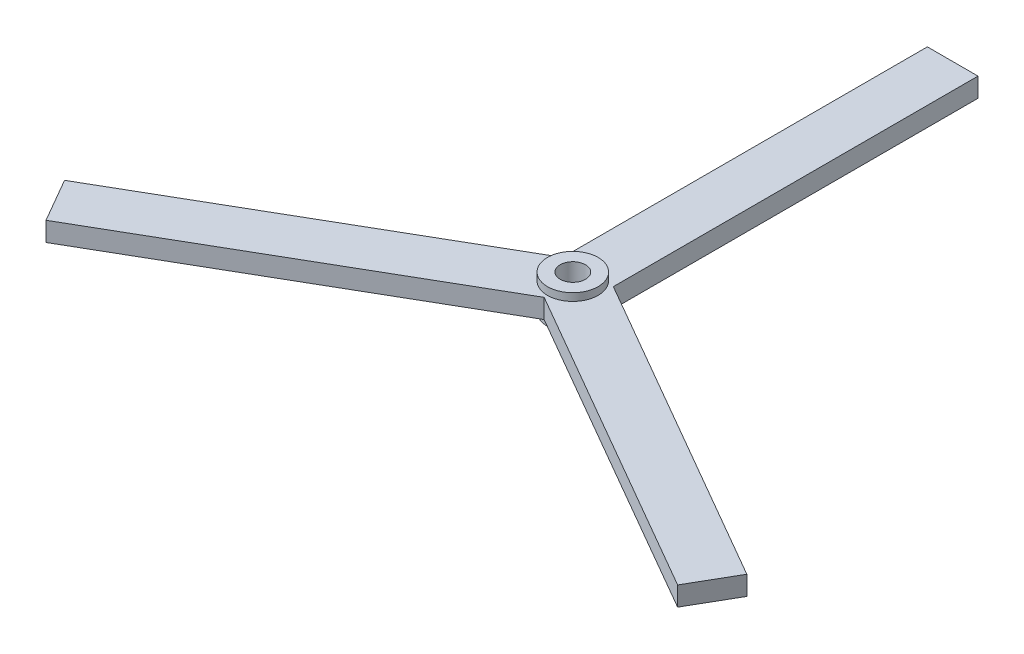
ISO-10303-21;
HEADER;
FILE_DESCRIPTION(('STEP AP214'),'2;1');
FILE_NAME('part.step','',(''),(''),'','','');
FILE_SCHEMA(('AUTOMOTIVE_DESIGN { 1 0 10303 214 1 1 1 1 }'));
ENDSEC;
DATA;
#1=APPLICATION_CONTEXT('core data for automotive mechanical design processes');
#2=APPLICATION_PROTOCOL_DEFINITION('international standard','automotive_design',2000,#1);
#3=PRODUCT_CONTEXT('',#1,'mechanical');
#4=PRODUCT('Part','Part','',(#3));
#5=PRODUCT_RELATED_PRODUCT_CATEGORY('part','',(#4));
#6=PRODUCT_DEFINITION_FORMATION('','',#4);
#7=PRODUCT_DEFINITION_CONTEXT('part definition',#1,'design');
#8=PRODUCT_DEFINITION('design','',#6,#7);
#9=PRODUCT_DEFINITION_SHAPE('','',#8);
#10=(LENGTH_UNIT() NAMED_UNIT(*) SI_UNIT(.MILLI.,.METRE.));
#11=(NAMED_UNIT(*) PLANE_ANGLE_UNIT() SI_UNIT($,.RADIAN.));
#12=(NAMED_UNIT(*) SI_UNIT($,.STERADIAN.) SOLID_ANGLE_UNIT());
#13=UNCERTAINTY_MEASURE_WITH_UNIT(LENGTH_MEASURE(1.E-05),#10,'distance_accuracy_value','');
#14=(GEOMETRIC_REPRESENTATION_CONTEXT(3) GLOBAL_UNCERTAINTY_ASSIGNED_CONTEXT((#13)) GLOBAL_UNIT_ASSIGNED_CONTEXT((#10,
#11,#12)) REPRESENTATION_CONTEXT('',''));
#15=CARTESIAN_POINT('',(0.,0.,0.));
#16=DIRECTION('',(0.,0.,1.));
#17=DIRECTION('',(1.,0.,0.));
#18=AXIS2_PLACEMENT_3D('',#15,#16,#17);
#19=CARTESIAN_POINT('',(0.,3.4,0.));
#20=DIRECTION('',(0.,-1.,0.));
#21=DIRECTION('',(0.,0.,-1.));
#22=AXIS2_PLACEMENT_3D('',#19,#20,#21);
#23=CYLINDRICAL_SURFACE('',#22,5.);
#24=CARTESIAN_POINT('',(0.,-3.4,0.));
#25=DIRECTION('',(0.,1.,0.));
#26=DIRECTION('',(0.,0.,1.));
#27=AXIS2_PLACEMENT_3D('',#24,#25,#26);
#28=CIRCLE('',#27,5.);
#29=CARTESIAN_POINT('',(0.,-3.4,5.));
#30=VERTEX_POINT('',#29);
#31=EDGE_CURVE('E187',#30,#30,#28,.T.);
#32=ORIENTED_EDGE('',*,*,#31,.T.);
#33=EDGE_LOOP('',(#32));
#34=FACE_BOUND('',#33,.T.);
#35=CARTESIAN_POINT('',(0.,-1.9,0.));
#36=DIRECTION('',(0.,1.,0.));
#37=DIRECTION('',(0.,0.,1.));
#38=AXIS2_PLACEMENT_3D('',#35,#36,#37);
#39=CIRCLE('',#38,5.);
#40=CARTESIAN_POINT('',(0.,-1.9,5.));
#41=VERTEX_POINT('',#40);
#42=EDGE_CURVE('E11',#41,#41,#39,.T.);
#43=ORIENTED_EDGE('',*,*,#42,.F.);
#44=EDGE_LOOP('',(#43));
#45=FACE_BOUND('',#44,.T.);
#46=ADVANCED_FACE('F43',(#34,#45),#23,.T.);
#47=CARTESIAN_POINT('',(0.,3.4,0.));
#48=DIRECTION('',(0.,1.,0.));
#49=DIRECTION('',(0.,0.,1.));
#50=AXIS2_PLACEMENT_3D('',#47,#48,#49);
#51=PLANE('',#50);
#52=CARTESIAN_POINT('',(0.,3.4,0.));
#53=DIRECTION('',(0.,1.,0.));
#54=DIRECTION('',(0.,0.,1.));
#55=AXIS2_PLACEMENT_3D('',#52,#53,#54);
#56=CIRCLE('',#55,5.);
#57=CARTESIAN_POINT('',(0.,3.4,5.));
#58=VERTEX_POINT('',#57);
#59=EDGE_CURVE('E52',#58,#58,#56,.T.);
#60=ORIENTED_EDGE('',*,*,#59,.T.);
#61=EDGE_LOOP('',(#60));
#62=FACE_BOUND('',#61,.T.);
#63=CARTESIAN_POINT('',(0.,3.4,0.));
#64=DIRECTION('',(0.,1.,0.));
#65=DIRECTION('',(0.,0.,1.));
#66=AXIS2_PLACEMENT_3D('',#63,#64,#65);
#67=CIRCLE('',#66,2.5);
#68=CARTESIAN_POINT('',(0.,3.4,2.5));
#69=VERTEX_POINT('',#68);
#70=EDGE_CURVE('E184',#69,#69,#67,.T.);
#71=ORIENTED_EDGE('',*,*,#70,.F.);
#72=EDGE_LOOP('',(#71));
#73=FACE_BOUND('',#72,.T.);
#74=ADVANCED_FACE('F199',(#62,#73),#51,.T.);
#75=CARTESIAN_POINT('',(0.,-3.4,0.));
#76=DIRECTION('',(0.,1.,0.));
#77=DIRECTION('',(0.,0.,1.));
#78=AXIS2_PLACEMENT_3D('',#75,#76,#77);
#79=PLANE('',#78);
#80=ORIENTED_EDGE('',*,*,#31,.F.);
#81=EDGE_LOOP('',(#80));
#82=FACE_BOUND('',#81,.T.);
#83=CARTESIAN_POINT('',(0.,-3.4,0.));
#84=DIRECTION('',(0.,1.,0.));
#85=DIRECTION('',(0.,0.,1.));
#86=AXIS2_PLACEMENT_3D('',#83,#84,#85);
#87=CIRCLE('',#86,2.5);
#88=CARTESIAN_POINT('',(0.,-3.4,2.5));
#89=VERTEX_POINT('',#88);
#90=EDGE_CURVE('E183',#89,#89,#87,.T.);
#91=ORIENTED_EDGE('',*,*,#90,.T.);
#92=EDGE_LOOP('',(#91));
#93=FACE_BOUND('',#92,.T.);
#94=ADVANCED_FACE('F196',(#82,#93),#79,.F.);
#95=CARTESIAN_POINT('',(0.,1.9,0.));
#96=DIRECTION('',(0.,1.,0.));
#97=DIRECTION('',(0.,0.,1.));
#98=AXIS2_PLACEMENT_3D('',#95,#96,#97);
#99=CIRCLE('',#98,5.);
#100=CARTESIAN_POINT('',(0.,1.9,5.));
#101=VERTEX_POINT('',#100);
#102=EDGE_CURVE('E152',#101,#101,#99,.T.);
#103=ORIENTED_EDGE('',*,*,#102,.T.);
#104=EDGE_LOOP('',(#103));
#105=FACE_BOUND('',#104,.T.);
#106=ORIENTED_EDGE('',*,*,#59,.F.);
#107=EDGE_LOOP('',(#106));
#108=FACE_BOUND('',#107,.T.);
#109=ADVANCED_FACE('F45',(#105,#108),#23,.T.);
#110=CARTESIAN_POINT('',(0.,3.4,0.));
#111=DIRECTION('',(0.,-1.,0.));
#112=DIRECTION('',(0.,0.,-1.));
#113=AXIS2_PLACEMENT_3D('',#110,#111,#112);
#114=CYLINDRICAL_SURFACE('',#113,2.5);
#115=ORIENTED_EDGE('',*,*,#70,.T.);
#116=EDGE_LOOP('',(#115));
#117=FACE_BOUND('',#116,.T.);
#118=ORIENTED_EDGE('',*,*,#90,.F.);
#119=EDGE_LOOP('',(#118));
#120=FACE_BOUND('',#119,.T.);
#121=ADVANCED_FACE('F202',(#117,#120),#114,.F.);
#122=CARTESIAN_POINT('',(0.,1.9,0.));
#123=DIRECTION('',(0.,1.,0.));
#124=DIRECTION('',(0.,0.,1.));
#125=AXIS2_PLACEMENT_3D('',#122,#123,#124);
#126=PLANE('',#125);
#127=DIRECTION('',(-1.,0.,0.));
#128=VECTOR('',#127,1.);
#129=CARTESIAN_POINT('',(-5.,1.9,-75.));
#130=LINE('',#129,#128);
#131=CARTESIAN_POINT('',(5.,1.9,-75.));
#132=VERTEX_POINT('',#131);
#133=CARTESIAN_POINT('',(-5.,1.9,-75.));
#134=VERTEX_POINT('',#133);
#135=EDGE_CURVE('E165',#132,#134,#130,.T.);
#136=ORIENTED_EDGE('',*,*,#135,.T.);
#137=DIRECTION('',(0.,0.,1.));
#138=VECTOR('',#137,1.);
#139=CARTESIAN_POINT('',(-5.,1.9,-3.00249609933335));
#140=LINE('',#139,#138);
#141=CARTESIAN_POINT('',(-5.,1.9,-3.00249609933335));
#142=VERTEX_POINT('',#141);
#143=EDGE_CURVE('E107',#134,#142,#140,.T.);
#144=ORIENTED_EDGE('',*,*,#143,.T.);
#145=DIRECTION('',(-0.866025403784439,0.,0.5));
#146=VECTOR('',#145,1.);
#147=CARTESIAN_POINT('',(-5.,1.9,-3.00249609933335));
#148=LINE('',#147,#146);
#149=CARTESIAN_POINT('',(-67.3516673870465,1.9,32.996255851));
#150=VERTEX_POINT('',#149);
#151=EDGE_CURVE('E370',#142,#150,#148,.T.);
#152=ORIENTED_EDGE('',*,*,#151,.T.);
#153=DIRECTION('',(0.5,0.,0.866025403784438));
#154=VECTOR('',#153,1.);
#155=CARTESIAN_POINT('',(-62.3516673870465,1.9,41.6565098888444));
#156=LINE('',#155,#154);
#157=CARTESIAN_POINT('',(-62.3516673870465,1.9,41.6565098888444));
#158=VERTEX_POINT('',#157);
#159=EDGE_CURVE('E375',#150,#158,#156,.T.);
#160=ORIENTED_EDGE('',*,*,#159,.T.);
#161=DIRECTION('',(0.866025403784438,0.,-0.500000000000001));
#162=VECTOR('',#161,1.);
#163=CARTESIAN_POINT('',(0.,1.9,5.65775793851104));
#164=LINE('',#163,#162);
#165=CARTESIAN_POINT('',(0.,1.9,5.65775793851104));
#166=VERTEX_POINT('',#165);
#167=EDGE_CURVE('E377',#158,#166,#164,.T.);
#168=ORIENTED_EDGE('',*,*,#167,.T.);
#169=DIRECTION('',(0.866025403784438,0.,0.5));
#170=VECTOR('',#169,1.);
#171=CARTESIAN_POINT('',(0.,1.9,5.65775793851104));
#172=LINE('',#171,#170);
#173=CARTESIAN_POINT('',(62.3516673870465,1.9,41.6565098888444));
#174=VERTEX_POINT('',#173);
#175=EDGE_CURVE('E130',#166,#174,#172,.T.);
#176=ORIENTED_EDGE('',*,*,#175,.T.);
#177=DIRECTION('',(0.499999999999999,0.,-0.866025403784439));
#178=VECTOR('',#177,1.);
#179=CARTESIAN_POINT('',(67.3516673870465,1.9,32.996255851));
#180=LINE('',#179,#178);
#181=CARTESIAN_POINT('',(67.3516673870465,1.9,32.996255851));
#182=VERTEX_POINT('',#181);
#183=EDGE_CURVE('E123',#174,#182,#180,.T.);
#184=ORIENTED_EDGE('',*,*,#183,.T.);
#185=DIRECTION('',(-0.866025403784439,0.,-0.5));
#186=VECTOR('',#185,1.);
#187=CARTESIAN_POINT('',(5.,1.9,-3.00249609933334));
#188=LINE('',#187,#186);
#189=CARTESIAN_POINT('',(5.,1.9,-3.00249609933334));
#190=VERTEX_POINT('',#189);
#191=EDGE_CURVE('E128',#182,#190,#188,.T.);
#192=ORIENTED_EDGE('',*,*,#191,.T.);
#193=DIRECTION('',(0.,0.,-1.));
#194=VECTOR('',#193,1.);
#195=CARTESIAN_POINT('',(5.,1.9,-3.00249609933334));
#196=LINE('',#195,#194);
#197=EDGE_CURVE('E60',#190,#132,#196,.T.);
#198=ORIENTED_EDGE('',*,*,#197,.T.);
#199=EDGE_LOOP('',(#136,#144,#152,#160,#168,#176,#184,#192,#198));
#200=FACE_BOUND('',#199,.T.);
#201=ORIENTED_EDGE('',*,*,#102,.F.);
#202=EDGE_LOOP('',(#201));
#203=FACE_BOUND('',#202,.T.);
#204=ADVANCED_FACE('F125',(#200,#203),#126,.T.);
#205=CARTESIAN_POINT('',(0.,-1.9,0.));
#206=DIRECTION('',(0.,1.,0.));
#207=DIRECTION('',(0.,0.,1.));
#208=AXIS2_PLACEMENT_3D('',#205,#206,#207);
#209=PLANE('',#208);
#210=DIRECTION('',(-1.,0.,0.));
#211=VECTOR('',#210,1.);
#212=CARTESIAN_POINT('',(-5.,-1.9,-75.));
#213=LINE('',#212,#211);
#214=CARTESIAN_POINT('',(5.,-1.9,-75.));
#215=VERTEX_POINT('',#214);
#216=CARTESIAN_POINT('',(-5.,-1.9,-75.));
#217=VERTEX_POINT('',#216);
#218=EDGE_CURVE('E148',#215,#217,#213,.T.);
#219=ORIENTED_EDGE('',*,*,#218,.F.);
#220=DIRECTION('',(0.,0.,-1.));
#221=VECTOR('',#220,1.);
#222=CARTESIAN_POINT('',(5.,-1.9,-3.00249609933334));
#223=LINE('',#222,#221);
#224=CARTESIAN_POINT('',(5.,-1.9,-3.00249609933334));
#225=VERTEX_POINT('',#224);
#226=EDGE_CURVE('E98',#225,#215,#223,.T.);
#227=ORIENTED_EDGE('',*,*,#226,.F.);
#228=DIRECTION('',(-0.866025403784439,0.,-0.5));
#229=VECTOR('',#228,1.);
#230=CARTESIAN_POINT('',(5.,-1.9,-3.00249609933334));
#231=LINE('',#230,#229);
#232=CARTESIAN_POINT('',(67.3516673870465,-1.9,32.996255851));
#233=VERTEX_POINT('',#232);
#234=EDGE_CURVE('E92',#233,#225,#231,.T.);
#235=ORIENTED_EDGE('',*,*,#234,.F.);
#236=DIRECTION('',(0.499999999999999,0.,-0.866025403784439));
#237=VECTOR('',#236,1.);
#238=CARTESIAN_POINT('',(67.3516673870465,-1.9,32.996255851));
#239=LINE('',#238,#237);
#240=CARTESIAN_POINT('',(62.3516673870465,-1.9,41.6565098888444));
#241=VERTEX_POINT('',#240);
#242=EDGE_CURVE('E138',#241,#233,#239,.T.);
#243=ORIENTED_EDGE('',*,*,#242,.F.);
#244=DIRECTION('',(0.866025403784438,0.,0.5));
#245=VECTOR('',#244,1.);
#246=CARTESIAN_POINT('',(0.,-1.9,5.65775793851104));
#247=LINE('',#246,#245);
#248=CARTESIAN_POINT('',(0.,-1.9,5.65775793851104));
#249=VERTEX_POINT('',#248);
#250=EDGE_CURVE('E160',#249,#241,#247,.T.);
#251=ORIENTED_EDGE('',*,*,#250,.F.);
#252=DIRECTION('',(0.866025403784438,0.,-0.500000000000001));
#253=VECTOR('',#252,1.);
#254=CARTESIAN_POINT('',(0.,-1.9,5.65775793851104));
#255=LINE('',#254,#253);
#256=CARTESIAN_POINT('',(-62.3516673870465,-1.9,41.6565098888444));
#257=VERTEX_POINT('',#256);
#258=EDGE_CURVE('E158',#257,#249,#255,.T.);
#259=ORIENTED_EDGE('',*,*,#258,.F.);
#260=DIRECTION('',(0.5,0.,0.866025403784438));
#261=VECTOR('',#260,1.);
#262=CARTESIAN_POINT('',(-62.3516673870465,-1.9,41.6565098888444));
#263=LINE('',#262,#261);
#264=CARTESIAN_POINT('',(-67.3516673870465,-1.9,32.996255851));
#265=VERTEX_POINT('',#264);
#266=EDGE_CURVE('E156',#265,#257,#263,.T.);
#267=ORIENTED_EDGE('',*,*,#266,.F.);
#268=DIRECTION('',(-0.866025403784439,0.,0.5));
#269=VECTOR('',#268,1.);
#270=CARTESIAN_POINT('',(-5.,-1.9,-3.00249609933335));
#271=LINE('',#270,#269);
#272=CARTESIAN_POINT('',(-5.,-1.9,-3.00249609933335));
#273=VERTEX_POINT('',#272);
#274=EDGE_CURVE('E154',#273,#265,#271,.T.);
#275=ORIENTED_EDGE('',*,*,#274,.F.);
#276=DIRECTION('',(0.,0.,1.));
#277=VECTOR('',#276,1.);
#278=CARTESIAN_POINT('',(-5.,-1.9,-3.00249609933335));
#279=LINE('',#278,#277);
#280=EDGE_CURVE('E151',#217,#273,#279,.T.);
#281=ORIENTED_EDGE('',*,*,#280,.F.);
#282=EDGE_LOOP('',(#219,#227,#235,#243,#251,#259,#267,#275,#281));
#283=FACE_BOUND('',#282,.T.);
#284=ORIENTED_EDGE('',*,*,#42,.T.);
#285=EDGE_LOOP('',(#284));
#286=FACE_BOUND('',#285,.T.);
#287=ADVANCED_FACE('F210',(#283,#286),#209,.F.);
#288=CARTESIAN_POINT('',(-5.,1.9,-75.));
#289=DIRECTION('',(0.,0.,1.));
#290=DIRECTION('',(1.,0.,0.));
#291=AXIS2_PLACEMENT_3D('',#288,#289,#290);
#292=PLANE('',#291);
#293=ORIENTED_EDGE('',*,*,#218,.T.);
#294=DIRECTION('',(0.,-1.,0.));
#295=VECTOR('',#294,1.);
#296=CARTESIAN_POINT('',(-5.,1.9,-75.));
#297=LINE('',#296,#295);
#298=EDGE_CURVE('E181',#134,#217,#297,.T.);
#299=ORIENTED_EDGE('',*,*,#298,.F.);
#300=ORIENTED_EDGE('',*,*,#135,.F.);
#301=DIRECTION('',(0.,-1.,0.));
#302=VECTOR('',#301,1.);
#303=CARTESIAN_POINT('',(5.,1.9,-75.));
#304=LINE('',#303,#302);
#305=EDGE_CURVE('E144',#132,#215,#304,.T.);
#306=ORIENTED_EDGE('',*,*,#305,.T.);
#307=EDGE_LOOP('',(#293,#299,#300,#306));
#308=FACE_BOUND('',#307,.T.);
#309=ADVANCED_FACE('F253',(#308),#292,.F.);
#310=CARTESIAN_POINT('',(-5.,1.9,-3.00249609933335));
#311=DIRECTION('',(1.,0.,0.));
#312=DIRECTION('',(0.,0.,-1.));
#313=AXIS2_PLACEMENT_3D('',#310,#311,#312);
#314=PLANE('',#313);
#315=ORIENTED_EDGE('',*,*,#280,.T.);
#316=DIRECTION('',(0.,-1.,0.));
#317=VECTOR('',#316,1.);
#318=CARTESIAN_POINT('',(-5.,1.9,-3.00249609933335));
#319=LINE('',#318,#317);
#320=EDGE_CURVE('E178',#142,#273,#319,.T.);
#321=ORIENTED_EDGE('',*,*,#320,.F.);
#322=ORIENTED_EDGE('',*,*,#143,.F.);
#323=ORIENTED_EDGE('',*,*,#298,.T.);
#324=EDGE_LOOP('',(#315,#321,#322,#323));
#325=FACE_BOUND('',#324,.T.);
#326=ADVANCED_FACE('F264',(#325),#314,.F.);
#327=CARTESIAN_POINT('',(-5.,1.9,-3.00249609933335));
#328=DIRECTION('',(0.5,0.,0.866025403784438));
#329=DIRECTION('',(0.866025403784439,0.,-0.5));
#330=AXIS2_PLACEMENT_3D('',#327,#328,#329);
#331=PLANE('',#330);
#332=ORIENTED_EDGE('',*,*,#274,.T.);
#333=DIRECTION('',(0.,-1.,0.));
#334=VECTOR('',#333,1.);
#335=CARTESIAN_POINT('',(-67.3516673870465,1.9,32.996255851));
#336=LINE('',#335,#334);
#337=EDGE_CURVE('E175',#150,#265,#336,.T.);
#338=ORIENTED_EDGE('',*,*,#337,.F.);
#339=ORIENTED_EDGE('',*,*,#151,.F.);
#340=ORIENTED_EDGE('',*,*,#320,.T.);
#341=EDGE_LOOP('',(#332,#338,#339,#340));
#342=FACE_BOUND('',#341,.T.);
#343=ADVANCED_FACE('F274',(#342),#331,.F.);
#344=CARTESIAN_POINT('',(-62.3516673870465,1.9,41.6565098888444));
#345=DIRECTION('',(0.866025403784438,0.,-0.5));
#346=DIRECTION('',(-0.5,0.,-0.866025403784438));
#347=AXIS2_PLACEMENT_3D('',#344,#345,#346);
#348=PLANE('',#347);
#349=ORIENTED_EDGE('',*,*,#266,.T.);
#350=DIRECTION('',(0.,-1.,0.));
#351=VECTOR('',#350,1.);
#352=CARTESIAN_POINT('',(-62.3516673870465,1.9,41.6565098888444));
#353=LINE('',#352,#351);
#354=EDGE_CURVE('E172',#158,#257,#353,.T.);
#355=ORIENTED_EDGE('',*,*,#354,.F.);
#356=ORIENTED_EDGE('',*,*,#159,.F.);
#357=ORIENTED_EDGE('',*,*,#337,.T.);
#358=EDGE_LOOP('',(#349,#355,#356,#357));
#359=FACE_BOUND('',#358,.T.);
#360=ADVANCED_FACE('F284',(#359),#348,.F.);
#361=CARTESIAN_POINT('',(0.,1.9,5.65775793851104));
#362=DIRECTION('',(-0.500000000000001,0.,-0.866025403784438));
#363=DIRECTION('',(-0.866025403784438,0.,0.500000000000001));
#364=AXIS2_PLACEMENT_3D('',#361,#362,#363);
#365=PLANE('',#364);
#366=ORIENTED_EDGE('',*,*,#258,.T.);
#367=DIRECTION('',(0.,-1.,0.));
#368=VECTOR('',#367,1.);
#369=CARTESIAN_POINT('',(0.,1.9,5.65775793851104));
#370=LINE('',#369,#368);
#371=EDGE_CURVE('E169',#166,#249,#370,.T.);
#372=ORIENTED_EDGE('',*,*,#371,.F.);
#373=ORIENTED_EDGE('',*,*,#167,.F.);
#374=ORIENTED_EDGE('',*,*,#354,.T.);
#375=EDGE_LOOP('',(#366,#372,#373,#374));
#376=FACE_BOUND('',#375,.T.);
#377=ADVANCED_FACE('F295',(#376),#365,.F.);
#378=CARTESIAN_POINT('',(0.,1.9,5.65775793851104));
#379=DIRECTION('',(0.5,0.,-0.866025403784439));
#380=DIRECTION('',(-0.866025403784439,0.,-0.5));
#381=AXIS2_PLACEMENT_3D('',#378,#379,#380);
#382=PLANE('',#381);
#383=ORIENTED_EDGE('',*,*,#250,.T.);
#384=DIRECTION('',(0.,-1.,0.));
#385=VECTOR('',#384,1.);
#386=CARTESIAN_POINT('',(62.3516673870465,1.9,41.6565098888444));
#387=LINE('',#386,#385);
#388=EDGE_CURVE('E139',#174,#241,#387,.T.);
#389=ORIENTED_EDGE('',*,*,#388,.F.);
#390=ORIENTED_EDGE('',*,*,#175,.F.);
#391=ORIENTED_EDGE('',*,*,#371,.T.);
#392=EDGE_LOOP('',(#383,#389,#390,#391));
#393=FACE_BOUND('',#392,.T.);
#394=ADVANCED_FACE('F306',(#393),#382,.F.);
#395=CARTESIAN_POINT('',(67.3516673870465,1.9,32.996255851));
#396=DIRECTION('',(-0.866025403784439,0.,-0.499999999999999));
#397=DIRECTION('',(-0.499999999999999,0.,0.866025403784439));
#398=AXIS2_PLACEMENT_3D('',#395,#396,#397);
#399=PLANE('',#398);
#400=ORIENTED_EDGE('',*,*,#242,.T.);
#401=DIRECTION('',(0.,-1.,0.));
#402=VECTOR('',#401,1.);
#403=CARTESIAN_POINT('',(67.3516673870465,1.9,32.996255851));
#404=LINE('',#403,#402);
#405=EDGE_CURVE('E135',#182,#233,#404,.T.);
#406=ORIENTED_EDGE('',*,*,#405,.F.);
#407=ORIENTED_EDGE('',*,*,#183,.F.);
#408=ORIENTED_EDGE('',*,*,#388,.T.);
#409=EDGE_LOOP('',(#400,#406,#407,#408));
#410=FACE_BOUND('',#409,.T.);
#411=ADVANCED_FACE('F136',(#410),#399,.F.);
#412=CARTESIAN_POINT('',(5.,1.9,-3.00249609933334));
#413=DIRECTION('',(-0.5,0.,0.866025403784439));
#414=DIRECTION('',(0.866025403784439,0.,0.5));
#415=AXIS2_PLACEMENT_3D('',#412,#413,#414);
#416=PLANE('',#415);
#417=ORIENTED_EDGE('',*,*,#234,.T.);
#418=DIRECTION('',(0.,-1.,0.));
#419=VECTOR('',#418,1.);
#420=CARTESIAN_POINT('',(5.,1.9,-3.00249609933334));
#421=LINE('',#420,#419);
#422=EDGE_CURVE('E140',#190,#225,#421,.T.);
#423=ORIENTED_EDGE('',*,*,#422,.F.);
#424=ORIENTED_EDGE('',*,*,#191,.F.);
#425=ORIENTED_EDGE('',*,*,#405,.T.);
#426=EDGE_LOOP('',(#417,#423,#424,#425));
#427=FACE_BOUND('',#426,.T.);
#428=ADVANCED_FACE('F142',(#427),#416,.F.);
#429=CARTESIAN_POINT('',(5.,1.9,-3.00249609933334));
#430=DIRECTION('',(-1.,0.,0.));
#431=DIRECTION('',(0.,0.,1.));
#432=AXIS2_PLACEMENT_3D('',#429,#430,#431);
#433=PLANE('',#432);
#434=ORIENTED_EDGE('',*,*,#226,.T.);
#435=ORIENTED_EDGE('',*,*,#305,.F.);
#436=ORIENTED_EDGE('',*,*,#197,.F.);
#437=ORIENTED_EDGE('',*,*,#422,.T.);
#438=EDGE_LOOP('',(#434,#435,#436,#437));
#439=FACE_BOUND('',#438,.T.);
#440=ADVANCED_FACE('F336',(#439),#433,.F.);
#441=CLOSED_SHELL('',(#46,#74,#94,#109,#121,#204,#287,#309,#326,#343,#360,#377,#394,#411,#428,#440));
#442=MANIFOLD_SOLID_BREP('B2',#441);
#443=ADVANCED_BREP_SHAPE_REPRESENTATION('',(#18,#442),#14);
#444=SHAPE_DEFINITION_REPRESENTATION(#9,#443);
ENDSEC;
END-ISO-10303-21;
